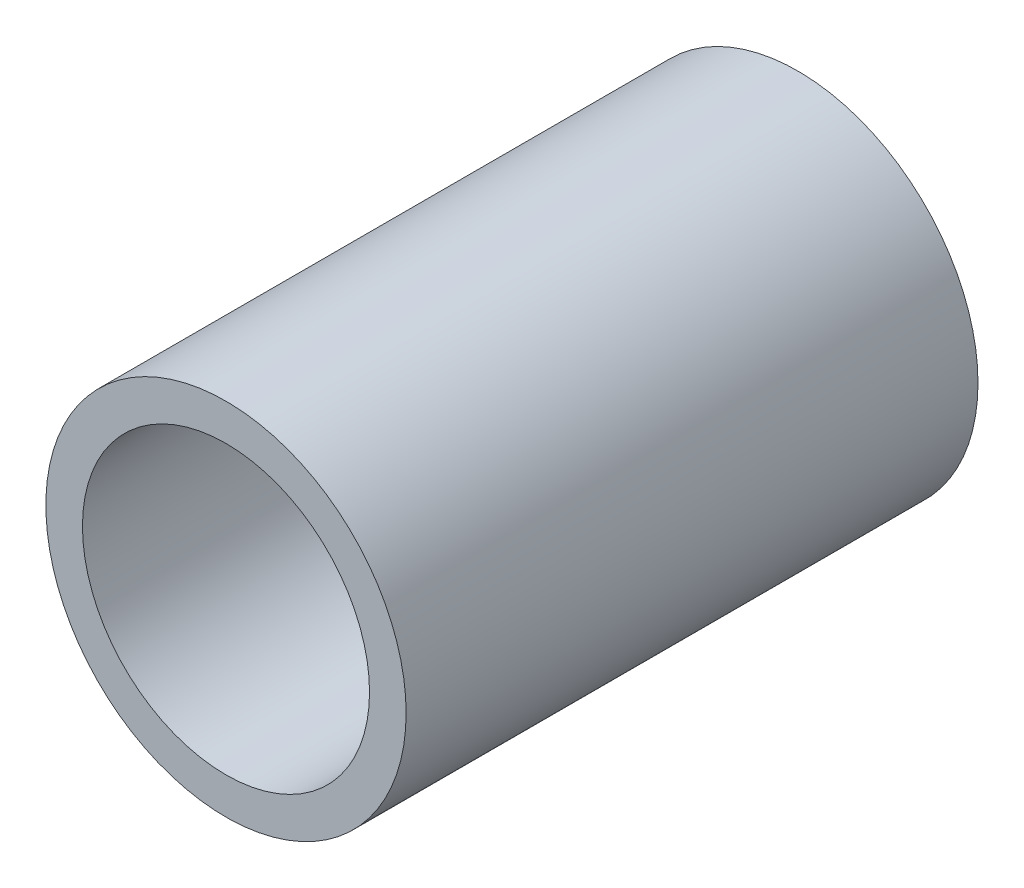
ISO-10303-21;
HEADER;
FILE_DESCRIPTION(('STEP AP214'),'2;1');
FILE_NAME('part.step','',(''),(''),'','','');
FILE_SCHEMA(('AUTOMOTIVE_DESIGN { 1 0 10303 214 1 1 1 1 }'));
ENDSEC;
DATA;
#1=APPLICATION_CONTEXT('core data for automotive mechanical design processes');
#2=APPLICATION_PROTOCOL_DEFINITION('international standard','automotive_design',2000,#1);
#3=PRODUCT_CONTEXT('',#1,'mechanical');
#4=PRODUCT('Part','Part','',(#3));
#5=PRODUCT_RELATED_PRODUCT_CATEGORY('part','',(#4));
#6=PRODUCT_DEFINITION_FORMATION('','',#4);
#7=PRODUCT_DEFINITION_CONTEXT('part definition',#1,'design');
#8=PRODUCT_DEFINITION('design','',#6,#7);
#9=PRODUCT_DEFINITION_SHAPE('','',#8);
#10=(LENGTH_UNIT() NAMED_UNIT(*) SI_UNIT(.MILLI.,.METRE.));
#11=(NAMED_UNIT(*) PLANE_ANGLE_UNIT() SI_UNIT($,.RADIAN.));
#12=(NAMED_UNIT(*) SI_UNIT($,.STERADIAN.) SOLID_ANGLE_UNIT());
#13=UNCERTAINTY_MEASURE_WITH_UNIT(LENGTH_MEASURE(1.E-05),#10,'distance_accuracy_value','');
#14=(GEOMETRIC_REPRESENTATION_CONTEXT(3) GLOBAL_UNCERTAINTY_ASSIGNED_CONTEXT((#13)) GLOBAL_UNIT_ASSIGNED_CONTEXT((#10,
#11,#12)) REPRESENTATION_CONTEXT('',''));
#15=CARTESIAN_POINT('',(0.,0.,0.));
#16=DIRECTION('',(0.,0.,1.));
#17=DIRECTION('',(1.,0.,0.));
#18=AXIS2_PLACEMENT_3D('',#15,#16,#17);
#19=CARTESIAN_POINT('',(0.,0.,6.35));
#20=DIRECTION('',(0.,0.,1.));
#21=DIRECTION('',(1.,0.,0.));
#22=AXIS2_PLACEMENT_3D('',#19,#20,#21);
#23=PLANE('',#22);
#24=CARTESIAN_POINT('',(0.,0.,6.35));
#25=DIRECTION('',(0.,0.,1.));
#26=DIRECTION('',(1.,0.,0.));
#27=AXIS2_PLACEMENT_3D('',#24,#25,#26);
#28=CIRCLE('',#27,4.0005);
#29=CARTESIAN_POINT('',(4.0005,0.,6.35));
#30=VERTEX_POINT('',#29);
#31=EDGE_CURVE('E10',#30,#30,#28,.T.);
#32=ORIENTED_EDGE('',*,*,#31,.T.);
#33=EDGE_LOOP('',(#32));
#34=FACE_BOUND('',#33,.T.);
#35=CARTESIAN_POINT('',(0.,0.,6.35));
#36=DIRECTION('',(0.,0.,1.));
#37=DIRECTION('',(1.,0.,0.));
#38=AXIS2_PLACEMENT_3D('',#35,#36,#37);
#39=CIRCLE('',#38,3.1877);
#40=CARTESIAN_POINT('',(3.1877,0.,6.35));
#41=VERTEX_POINT('',#40);
#42=EDGE_CURVE('E41',#41,#41,#39,.T.);
#43=ORIENTED_EDGE('',*,*,#42,.F.);
#44=EDGE_LOOP('',(#43));
#45=FACE_BOUND('',#44,.T.);
#46=ADVANCED_FACE('F30',(#34,#45),#23,.T.);
#47=CARTESIAN_POINT('',(0.,0.,-6.35));
#48=DIRECTION('',(0.,0.,1.));
#49=DIRECTION('',(1.,0.,0.));
#50=AXIS2_PLACEMENT_3D('',#47,#48,#49);
#51=PLANE('',#50);
#52=CARTESIAN_POINT('',(0.,0.,-6.35));
#53=DIRECTION('',(0.,0.,1.));
#54=DIRECTION('',(1.,0.,0.));
#55=AXIS2_PLACEMENT_3D('',#52,#53,#54);
#56=CIRCLE('',#55,4.0005);
#57=CARTESIAN_POINT('',(4.0005,0.,-6.35));
#58=VERTEX_POINT('',#57);
#59=EDGE_CURVE('E34',#58,#58,#56,.T.);
#60=ORIENTED_EDGE('',*,*,#59,.F.);
#61=EDGE_LOOP('',(#60));
#62=FACE_BOUND('',#61,.T.);
#63=CARTESIAN_POINT('',(0.,0.,-6.35));
#64=DIRECTION('',(0.,0.,1.));
#65=DIRECTION('',(1.,0.,0.));
#66=AXIS2_PLACEMENT_3D('',#63,#64,#65);
#67=CIRCLE('',#66,3.1877);
#68=CARTESIAN_POINT('',(3.1877,0.,-6.35));
#69=VERTEX_POINT('',#68);
#70=EDGE_CURVE('E43',#69,#69,#67,.T.);
#71=ORIENTED_EDGE('',*,*,#70,.T.);
#72=EDGE_LOOP('',(#71));
#73=FACE_BOUND('',#72,.T.);
#74=ADVANCED_FACE('F53',(#62,#73),#51,.F.);
#75=CARTESIAN_POINT('',(0.,0.,6.35));
#76=DIRECTION('',(0.,0.,-1.));
#77=DIRECTION('',(-1.,0.,0.));
#78=AXIS2_PLACEMENT_3D('',#75,#76,#77);
#79=CYLINDRICAL_SURFACE('',#78,4.0005);
#80=ORIENTED_EDGE('',*,*,#31,.F.);
#81=EDGE_LOOP('',(#80));
#82=FACE_BOUND('',#81,.T.);
#83=ORIENTED_EDGE('',*,*,#59,.T.);
#84=EDGE_LOOP('',(#83));
#85=FACE_BOUND('',#84,.T.);
#86=ADVANCED_FACE('F32',(#82,#85),#79,.T.);
#87=CARTESIAN_POINT('',(0.,0.,6.35));
#88=DIRECTION('',(0.,0.,-1.));
#89=DIRECTION('',(-1.,0.,0.));
#90=AXIS2_PLACEMENT_3D('',#87,#88,#89);
#91=CYLINDRICAL_SURFACE('',#90,3.1877);
#92=ORIENTED_EDGE('',*,*,#42,.T.);
#93=EDGE_LOOP('',(#92));
#94=FACE_BOUND('',#93,.T.);
#95=ORIENTED_EDGE('',*,*,#70,.F.);
#96=EDGE_LOOP('',(#95));
#97=FACE_BOUND('',#96,.T.);
#98=ADVANCED_FACE('F49',(#94,#97),#91,.F.);
#99=CLOSED_SHELL('',(#46,#74,#86,#98));
#100=MANIFOLD_SOLID_BREP('B2',#99);
#101=ADVANCED_BREP_SHAPE_REPRESENTATION('',(#18,#100),#14);
#102=SHAPE_DEFINITION_REPRESENTATION(#9,#101);
ENDSEC;
END-ISO-10303-21;
